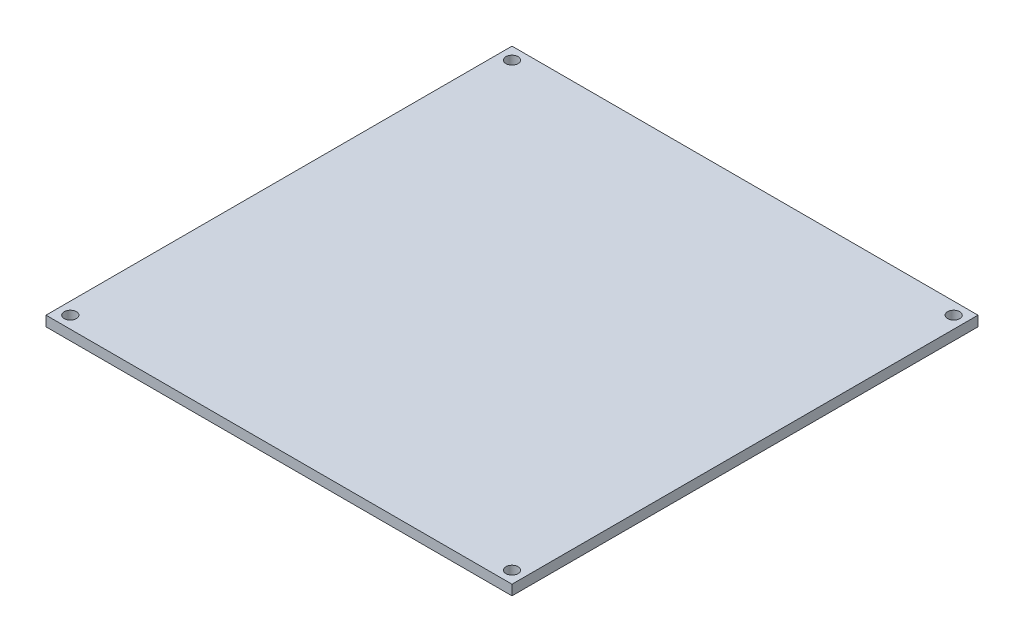
ISO-10303-21;
HEADER;
FILE_DESCRIPTION(('STEP AP214'),'2;1');
FILE_NAME('part.step','',(''),(''),'','','');
FILE_SCHEMA(('AUTOMOTIVE_DESIGN { 1 0 10303 214 1 1 1 1 }'));
ENDSEC;
DATA;
#1=APPLICATION_CONTEXT('core data for automotive mechanical design processes');
#2=APPLICATION_PROTOCOL_DEFINITION('international standard','automotive_design',2000,#1);
#3=PRODUCT_CONTEXT('',#1,'mechanical');
#4=PRODUCT('Part','Part','',(#3));
#5=PRODUCT_RELATED_PRODUCT_CATEGORY('part','',(#4));
#6=PRODUCT_DEFINITION_FORMATION('','',#4);
#7=PRODUCT_DEFINITION_CONTEXT('part definition',#1,'design');
#8=PRODUCT_DEFINITION('design','',#6,#7);
#9=PRODUCT_DEFINITION_SHAPE('','',#8);
#10=(LENGTH_UNIT() NAMED_UNIT(*) SI_UNIT(.MILLI.,.METRE.));
#11=(NAMED_UNIT(*) PLANE_ANGLE_UNIT() SI_UNIT($,.RADIAN.));
#12=(NAMED_UNIT(*) SI_UNIT($,.STERADIAN.) SOLID_ANGLE_UNIT());
#13=UNCERTAINTY_MEASURE_WITH_UNIT(LENGTH_MEASURE(1.E-05),#10,'distance_accuracy_value','');
#14=(GEOMETRIC_REPRESENTATION_CONTEXT(3) GLOBAL_UNCERTAINTY_ASSIGNED_CONTEXT((#13)) GLOBAL_UNIT_ASSIGNED_CONTEXT((#10,
#11,#12)) REPRESENTATION_CONTEXT('',''));
#15=CARTESIAN_POINT('',(0.,0.,0.));
#16=DIRECTION('',(0.,0.,1.));
#17=DIRECTION('',(1.,0.,0.));
#18=AXIS2_PLACEMENT_3D('',#15,#16,#17);
#19=CARTESIAN_POINT('',(0.,5.,0.));
#20=DIRECTION('',(1.,0.,0.));
#21=DIRECTION('',(0.,0.,-1.));
#22=AXIS2_PLACEMENT_3D('',#19,#20,#21);
#23=PLANE('',#22);
#24=DIRECTION('',(0.,0.,1.));
#25=VECTOR('',#24,1.);
#26=CARTESIAN_POINT('',(0.,0.,0.));
#27=LINE('',#26,#25);
#28=CARTESIAN_POINT('',(0.,0.,-230.));
#29=VERTEX_POINT('',#28);
#30=CARTESIAN_POINT('',(0.,0.,0.));
#31=VERTEX_POINT('',#30);
#32=EDGE_CURVE('E107',#29,#31,#27,.T.);
#33=ORIENTED_EDGE('',*,*,#32,.T.);
#34=DIRECTION('',(0.,-1.,0.));
#35=VECTOR('',#34,1.);
#36=CARTESIAN_POINT('',(0.,5.,0.));
#37=LINE('',#36,#35);
#38=CARTESIAN_POINT('',(0.,5.,0.));
#39=VERTEX_POINT('',#38);
#40=EDGE_CURVE('E11',#39,#31,#37,.T.);
#41=ORIENTED_EDGE('',*,*,#40,.F.);
#42=DIRECTION('',(0.,0.,1.));
#43=VECTOR('',#42,1.);
#44=CARTESIAN_POINT('',(0.,5.,0.));
#45=LINE('',#44,#43);
#46=CARTESIAN_POINT('',(0.,5.,-230.));
#47=VERTEX_POINT('',#46);
#48=EDGE_CURVE('E91',#47,#39,#45,.T.);
#49=ORIENTED_EDGE('',*,*,#48,.F.);
#50=DIRECTION('',(0.,-1.,0.));
#51=VECTOR('',#50,1.);
#52=CARTESIAN_POINT('',(0.,5.,-230.));
#53=LINE('',#52,#51);
#54=EDGE_CURVE('E103',#47,#29,#53,.T.);
#55=ORIENTED_EDGE('',*,*,#54,.T.);
#56=EDGE_LOOP('',(#33,#41,#49,#55));
#57=FACE_BOUND('',#56,.T.);
#58=ADVANCED_FACE('F39',(#57),#23,.F.);
#59=CARTESIAN_POINT('',(0.,5.,0.));
#60=DIRECTION('',(0.,0.,-1.));
#61=DIRECTION('',(-1.,0.,0.));
#62=AXIS2_PLACEMENT_3D('',#59,#60,#61);
#63=PLANE('',#62);
#64=DIRECTION('',(1.,0.,0.));
#65=VECTOR('',#64,1.);
#66=CARTESIAN_POINT('',(0.,0.,0.));
#67=LINE('',#66,#65);
#68=CARTESIAN_POINT('',(230.,0.,0.));
#69=VERTEX_POINT('',#68);
#70=EDGE_CURVE('E96',#31,#69,#67,.T.);
#71=ORIENTED_EDGE('',*,*,#70,.T.);
#72=DIRECTION('',(0.,-1.,0.));
#73=VECTOR('',#72,1.);
#74=CARTESIAN_POINT('',(230.,5.,0.));
#75=LINE('',#74,#73);
#76=CARTESIAN_POINT('',(230.,5.,0.));
#77=VERTEX_POINT('',#76);
#78=EDGE_CURVE('E48',#77,#69,#75,.T.);
#79=ORIENTED_EDGE('',*,*,#78,.F.);
#80=DIRECTION('',(1.,0.,0.));
#81=VECTOR('',#80,1.);
#82=CARTESIAN_POINT('',(0.,5.,0.));
#83=LINE('',#82,#81);
#84=EDGE_CURVE('E86',#39,#77,#83,.T.);
#85=ORIENTED_EDGE('',*,*,#84,.F.);
#86=ORIENTED_EDGE('',*,*,#40,.T.);
#87=EDGE_LOOP('',(#71,#79,#85,#86));
#88=FACE_BOUND('',#87,.T.);
#89=ADVANCED_FACE('F95',(#88),#63,.F.);
#90=CARTESIAN_POINT('',(230.,5.,0.));
#91=DIRECTION('',(-1.,0.,0.));
#92=DIRECTION('',(0.,0.,1.));
#93=AXIS2_PLACEMENT_3D('',#90,#91,#92);
#94=PLANE('',#93);
#95=DIRECTION('',(0.,0.,-1.));
#96=VECTOR('',#95,1.);
#97=CARTESIAN_POINT('',(230.,0.,0.));
#98=LINE('',#97,#96);
#99=CARTESIAN_POINT('',(230.,0.,-230.));
#100=VERTEX_POINT('',#99);
#101=EDGE_CURVE('E73',#69,#100,#98,.T.);
#102=ORIENTED_EDGE('',*,*,#101,.T.);
#103=DIRECTION('',(0.,-1.,0.));
#104=VECTOR('',#103,1.);
#105=CARTESIAN_POINT('',(230.,5.,-230.));
#106=LINE('',#105,#104);
#107=CARTESIAN_POINT('',(230.,5.,-230.));
#108=VERTEX_POINT('',#107);
#109=EDGE_CURVE('E98',#108,#100,#106,.T.);
#110=ORIENTED_EDGE('',*,*,#109,.F.);
#111=DIRECTION('',(0.,0.,-1.));
#112=VECTOR('',#111,1.);
#113=CARTESIAN_POINT('',(230.,5.,0.));
#114=LINE('',#113,#112);
#115=EDGE_CURVE('E89',#77,#108,#114,.T.);
#116=ORIENTED_EDGE('',*,*,#115,.F.);
#117=ORIENTED_EDGE('',*,*,#78,.T.);
#118=EDGE_LOOP('',(#102,#110,#116,#117));
#119=FACE_BOUND('',#118,.T.);
#120=ADVANCED_FACE('F99',(#119),#94,.F.);
#121=CARTESIAN_POINT('',(0.,5.,-230.));
#122=DIRECTION('',(0.,0.,1.));
#123=DIRECTION('',(1.,0.,0.));
#124=AXIS2_PLACEMENT_3D('',#121,#122,#123);
#125=PLANE('',#124);
#126=DIRECTION('',(-1.,0.,0.));
#127=VECTOR('',#126,1.);
#128=CARTESIAN_POINT('',(0.,0.,-230.));
#129=LINE('',#128,#127);
#130=EDGE_CURVE('E79',#100,#29,#129,.T.);
#131=ORIENTED_EDGE('',*,*,#130,.T.);
#132=ORIENTED_EDGE('',*,*,#54,.F.);
#133=DIRECTION('',(-1.,0.,0.));
#134=VECTOR('',#133,1.);
#135=CARTESIAN_POINT('',(0.,5.,-230.));
#136=LINE('',#135,#134);
#137=EDGE_CURVE('E56',#108,#47,#136,.T.);
#138=ORIENTED_EDGE('',*,*,#137,.F.);
#139=ORIENTED_EDGE('',*,*,#109,.T.);
#140=EDGE_LOOP('',(#131,#132,#138,#139));
#141=FACE_BOUND('',#140,.T.);
#142=ADVANCED_FACE('F121',(#141),#125,.F.);
#143=CARTESIAN_POINT('',(0.,5.,0.));
#144=DIRECTION('',(0.,-1.,0.));
#145=DIRECTION('',(0.,0.,-1.));
#146=AXIS2_PLACEMENT_3D('',#143,#144,#145);
#147=PLANE('',#146);
#148=CARTESIAN_POINT('',(224.,5.,-6.));
#149=DIRECTION('',(0.,1.,0.));
#150=DIRECTION('',(0.,0.,1.));
#151=AXIS2_PLACEMENT_3D('',#148,#149,#150);
#152=CIRCLE('',#151,2.99999999999999);
#153=CARTESIAN_POINT('',(224.,5.,-3.00000000000001));
#154=VERTEX_POINT('',#153);
#155=EDGE_CURVE('E152',#154,#154,#152,.T.);
#156=ORIENTED_EDGE('',*,*,#155,.F.);
#157=EDGE_LOOP('',(#156));
#158=FACE_BOUND('',#157,.T.);
#159=CARTESIAN_POINT('',(6.,5.,-6.));
#160=DIRECTION('',(0.,1.,0.));
#161=DIRECTION('',(0.,0.,1.));
#162=AXIS2_PLACEMENT_3D('',#159,#160,#161);
#163=CIRCLE('',#162,3.);
#164=CARTESIAN_POINT('',(6.,5.,-3.));
#165=VERTEX_POINT('',#164);
#166=EDGE_CURVE('E144',#165,#165,#163,.T.);
#167=ORIENTED_EDGE('',*,*,#166,.F.);
#168=EDGE_LOOP('',(#167));
#169=FACE_BOUND('',#168,.T.);
#170=CARTESIAN_POINT('',(224.,5.,-224.));
#171=DIRECTION('',(0.,1.,0.));
#172=DIRECTION('',(0.,0.,1.));
#173=AXIS2_PLACEMENT_3D('',#170,#171,#172);
#174=CIRCLE('',#173,2.99999999999999);
#175=CARTESIAN_POINT('',(224.,5.,-221.));
#176=VERTEX_POINT('',#175);
#177=EDGE_CURVE('E136',#176,#176,#174,.T.);
#178=ORIENTED_EDGE('',*,*,#177,.F.);
#179=EDGE_LOOP('',(#178));
#180=FACE_BOUND('',#179,.T.);
#181=CARTESIAN_POINT('',(6.,5.,-224.));
#182=DIRECTION('',(0.,1.,0.));
#183=DIRECTION('',(0.,0.,1.));
#184=AXIS2_PLACEMENT_3D('',#181,#182,#183);
#185=CIRCLE('',#184,3.);
#186=CARTESIAN_POINT('',(6.,5.,-221.));
#187=VERTEX_POINT('',#186);
#188=EDGE_CURVE('E128',#187,#187,#185,.T.);
#189=ORIENTED_EDGE('',*,*,#188,.F.);
#190=EDGE_LOOP('',(#189));
#191=FACE_BOUND('',#190,.T.);
#192=ORIENTED_EDGE('',*,*,#48,.T.);
#193=ORIENTED_EDGE('',*,*,#84,.T.);
#194=ORIENTED_EDGE('',*,*,#115,.T.);
#195=ORIENTED_EDGE('',*,*,#137,.T.);
#196=EDGE_LOOP('',(#192,#193,#194,#195));
#197=FACE_BOUND('',#196,.T.);
#198=ADVANCED_FACE('F87',(#158,#169,#180,#191,#197),#147,.F.);
#199=CARTESIAN_POINT('',(0.,0.,0.));
#200=DIRECTION('',(0.,-1.,0.));
#201=DIRECTION('',(0.,0.,-1.));
#202=AXIS2_PLACEMENT_3D('',#199,#200,#201);
#203=PLANE('',#202);
#204=CARTESIAN_POINT('',(224.,0.,-6.));
#205=DIRECTION('',(0.,1.,0.));
#206=DIRECTION('',(0.,0.,1.));
#207=AXIS2_PLACEMENT_3D('',#204,#205,#206);
#208=CIRCLE('',#207,2.99999999999999);
#209=CARTESIAN_POINT('',(224.,0.,-3.00000000000001));
#210=VERTEX_POINT('',#209);
#211=EDGE_CURVE('E148',#210,#210,#208,.T.);
#212=ORIENTED_EDGE('',*,*,#211,.T.);
#213=EDGE_LOOP('',(#212));
#214=FACE_BOUND('',#213,.T.);
#215=CARTESIAN_POINT('',(6.,0.,-6.));
#216=DIRECTION('',(0.,1.,0.));
#217=DIRECTION('',(0.,0.,1.));
#218=AXIS2_PLACEMENT_3D('',#215,#216,#217);
#219=CIRCLE('',#218,3.);
#220=CARTESIAN_POINT('',(6.,0.,-3.));
#221=VERTEX_POINT('',#220);
#222=EDGE_CURVE('E140',#221,#221,#219,.T.);
#223=ORIENTED_EDGE('',*,*,#222,.T.);
#224=EDGE_LOOP('',(#223));
#225=FACE_BOUND('',#224,.T.);
#226=CARTESIAN_POINT('',(224.,0.,-224.));
#227=DIRECTION('',(0.,1.,0.));
#228=DIRECTION('',(0.,0.,1.));
#229=AXIS2_PLACEMENT_3D('',#226,#227,#228);
#230=CIRCLE('',#229,2.99999999999999);
#231=CARTESIAN_POINT('',(224.,0.,-221.));
#232=VERTEX_POINT('',#231);
#233=EDGE_CURVE('E132',#232,#232,#230,.T.);
#234=ORIENTED_EDGE('',*,*,#233,.T.);
#235=EDGE_LOOP('',(#234));
#236=FACE_BOUND('',#235,.T.);
#237=CARTESIAN_POINT('',(6.,0.,-224.));
#238=DIRECTION('',(0.,1.,0.));
#239=DIRECTION('',(0.,0.,1.));
#240=AXIS2_PLACEMENT_3D('',#237,#238,#239);
#241=CIRCLE('',#240,3.);
#242=CARTESIAN_POINT('',(6.,0.,-221.));
#243=VERTEX_POINT('',#242);
#244=EDGE_CURVE('E111',#243,#243,#241,.T.);
#245=ORIENTED_EDGE('',*,*,#244,.T.);
#246=EDGE_LOOP('',(#245));
#247=FACE_BOUND('',#246,.T.);
#248=ORIENTED_EDGE('',*,*,#32,.F.);
#249=ORIENTED_EDGE('',*,*,#130,.F.);
#250=ORIENTED_EDGE('',*,*,#101,.F.);
#251=ORIENTED_EDGE('',*,*,#70,.F.);
#252=EDGE_LOOP('',(#248,#249,#250,#251));
#253=FACE_BOUND('',#252,.T.);
#254=ADVANCED_FACE('F124',(#214,#225,#236,#247,#253),#203,.T.);
#255=CARTESIAN_POINT('',(6.,0.,-224.));
#256=DIRECTION('',(0.,1.,0.));
#257=DIRECTION('',(0.,0.,1.));
#258=AXIS2_PLACEMENT_3D('',#255,#256,#257);
#259=CYLINDRICAL_SURFACE('',#258,3.);
#260=ORIENTED_EDGE('',*,*,#244,.F.);
#261=EDGE_LOOP('',(#260));
#262=FACE_BOUND('',#261,.T.);
#263=ORIENTED_EDGE('',*,*,#188,.T.);
#264=EDGE_LOOP('',(#263));
#265=FACE_BOUND('',#264,.T.);
#266=ADVANCED_FACE('F178',(#262,#265),#259,.F.);
#267=CARTESIAN_POINT('',(224.,0.,-224.));
#268=DIRECTION('',(0.,1.,0.));
#269=DIRECTION('',(0.,0.,1.));
#270=AXIS2_PLACEMENT_3D('',#267,#268,#269);
#271=CYLINDRICAL_SURFACE('',#270,2.99999999999999);
#272=ORIENTED_EDGE('',*,*,#233,.F.);
#273=EDGE_LOOP('',(#272));
#274=FACE_BOUND('',#273,.T.);
#275=ORIENTED_EDGE('',*,*,#177,.T.);
#276=EDGE_LOOP('',(#275));
#277=FACE_BOUND('',#276,.T.);
#278=ADVANCED_FACE('F180',(#274,#277),#271,.F.);
#279=CARTESIAN_POINT('',(6.,0.,-6.));
#280=DIRECTION('',(0.,1.,0.));
#281=DIRECTION('',(0.,0.,1.));
#282=AXIS2_PLACEMENT_3D('',#279,#280,#281);
#283=CYLINDRICAL_SURFACE('',#282,3.);
#284=ORIENTED_EDGE('',*,*,#222,.F.);
#285=EDGE_LOOP('',(#284));
#286=FACE_BOUND('',#285,.T.);
#287=ORIENTED_EDGE('',*,*,#166,.T.);
#288=EDGE_LOOP('',(#287));
#289=FACE_BOUND('',#288,.T.);
#290=ADVANCED_FACE('F165',(#286,#289),#283,.F.);
#291=CARTESIAN_POINT('',(224.,0.,-6.));
#292=DIRECTION('',(0.,1.,0.));
#293=DIRECTION('',(0.,0.,1.));
#294=AXIS2_PLACEMENT_3D('',#291,#292,#293);
#295=CYLINDRICAL_SURFACE('',#294,2.99999999999999);
#296=ORIENTED_EDGE('',*,*,#211,.F.);
#297=EDGE_LOOP('',(#296));
#298=FACE_BOUND('',#297,.T.);
#299=ORIENTED_EDGE('',*,*,#155,.T.);
#300=EDGE_LOOP('',(#299));
#301=FACE_BOUND('',#300,.T.);
#302=ADVANCED_FACE('F162',(#298,#301),#295,.F.);
#303=CLOSED_SHELL('',(#58,#89,#120,#142,#198,#254,#266,#278,#290,#302));
#304=MANIFOLD_SOLID_BREP('B2',#303);
#305=ADVANCED_BREP_SHAPE_REPRESENTATION('',(#18,#304),#14);
#306=SHAPE_DEFINITION_REPRESENTATION(#9,#305);
ENDSEC;
END-ISO-10303-21;
